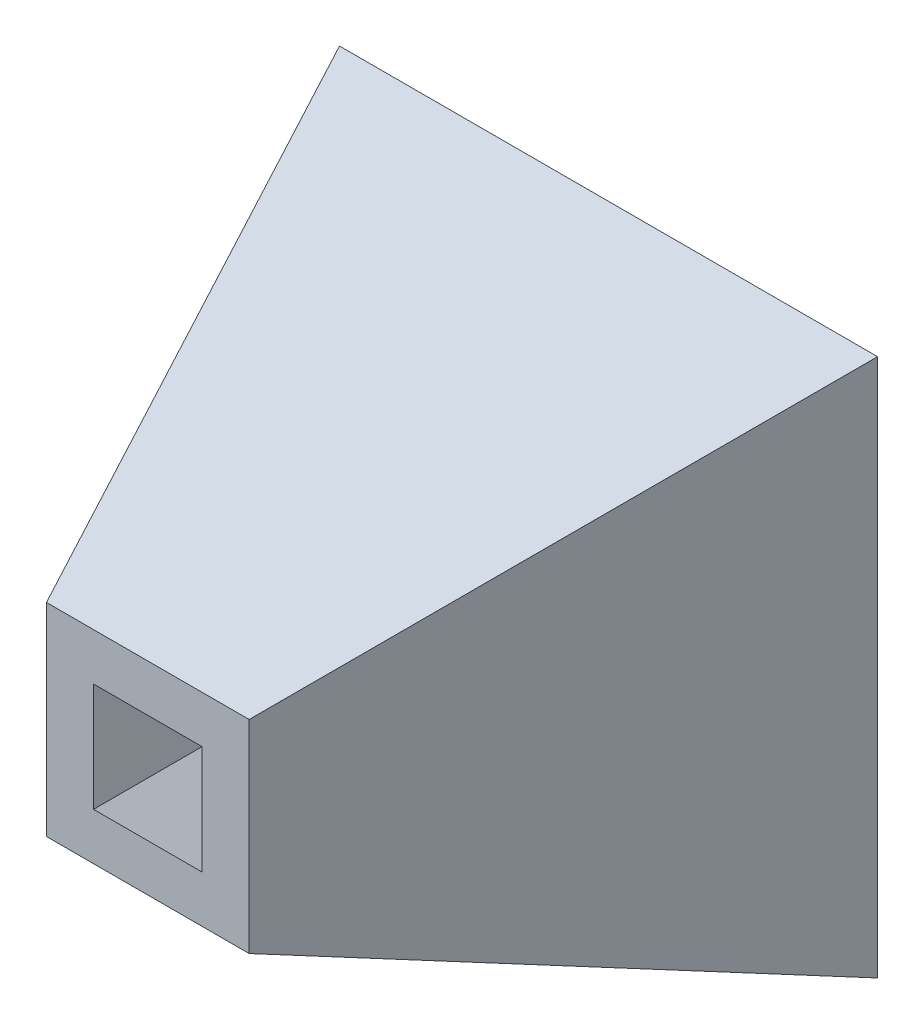
ISO-10303-21;
HEADER;
FILE_DESCRIPTION(('STEP AP214'),'2;1');
FILE_NAME('part.step','',(''),(''),'','','');
FILE_SCHEMA(('AUTOMOTIVE_DESIGN { 1 0 10303 214 1 1 1 1 }'));
ENDSEC;
DATA;
#1=APPLICATION_CONTEXT('core data for automotive mechanical design processes');
#2=APPLICATION_PROTOCOL_DEFINITION('international standard','automotive_design',2000,#1);
#3=PRODUCT_CONTEXT('',#1,'mechanical');
#4=PRODUCT('Part','Part','',(#3));
#5=PRODUCT_RELATED_PRODUCT_CATEGORY('part','',(#4));
#6=PRODUCT_DEFINITION_FORMATION('','',#4);
#7=PRODUCT_DEFINITION_CONTEXT('part definition',#1,'design');
#8=PRODUCT_DEFINITION('design','',#6,#7);
#9=PRODUCT_DEFINITION_SHAPE('','',#8);
#10=(LENGTH_UNIT() NAMED_UNIT(*) SI_UNIT(.MILLI.,.METRE.));
#11=(NAMED_UNIT(*) PLANE_ANGLE_UNIT() SI_UNIT($,.RADIAN.));
#12=(NAMED_UNIT(*) SI_UNIT($,.STERADIAN.) SOLID_ANGLE_UNIT());
#13=UNCERTAINTY_MEASURE_WITH_UNIT(LENGTH_MEASURE(1.E-05),#10,'distance_accuracy_value','');
#14=(GEOMETRIC_REPRESENTATION_CONTEXT(3) GLOBAL_UNCERTAINTY_ASSIGNED_CONTEXT((#13)) GLOBAL_UNIT_ASSIGNED_CONTEXT((#10,
#11,#12)) REPRESENTATION_CONTEXT('',''));
#15=CARTESIAN_POINT('',(0.,0.,0.));
#16=DIRECTION('',(0.,0.,1.));
#17=DIRECTION('',(1.,0.,0.));
#18=AXIS2_PLACEMENT_3D('',#15,#16,#17);
#19=CARTESIAN_POINT('',(0.,22.,50.));
#20=DIRECTION('',(-0.939692620785908,0.,0.342020143325669));
#21=DIRECTION('',(0.342020143325669,0.,0.939692620785908));
#22=AXIS2_PLACEMENT_3D('',#19,#20,#21);
#23=PLANE('',#22);
#24=DIRECTION('',(0.,1.,0.));
#25=VECTOR('',#24,1.);
#26=CARTESIAN_POINT('',(-18.1985117133102,22.,0.));
#27=LINE('',#26,#25);
#28=CARTESIAN_POINT('',(-18.1985117133102,40.1985117133102,0.));
#29=VERTEX_POINT('',#28);
#30=CARTESIAN_POINT('',(-18.1985117133102,-18.1985117133102,0.));
#31=VERTEX_POINT('',#30);
#32=EDGE_CURVE('E157',#29,#31,#27,.F.);
#33=ORIENTED_EDGE('',*,*,#32,.T.);
#34=DIRECTION('',(-0.323615577118185,-0.323615577118185,-0.889126490715988));
#35=VECTOR('',#34,1.);
#36=CARTESIAN_POINT('',(0.,0.,50.));
#37=LINE('',#36,#35);
#38=CARTESIAN_POINT('',(0.,0.,50.));
#39=VERTEX_POINT('',#38);
#40=EDGE_CURVE('E11',#39,#31,#37,.T.);
#41=ORIENTED_EDGE('',*,*,#40,.F.);
#42=DIRECTION('',(0.,-1.,0.));
#43=VECTOR('',#42,1.);
#44=CARTESIAN_POINT('',(0.,22.,50.));
#45=LINE('',#44,#43);
#46=CARTESIAN_POINT('',(0.,22.,50.));
#47=VERTEX_POINT('',#46);
#48=EDGE_CURVE('E137',#47,#39,#45,.T.);
#49=ORIENTED_EDGE('',*,*,#48,.F.);
#50=DIRECTION('',(-0.323615577118185,0.323615577118185,-0.889126490715988));
#51=VECTOR('',#50,1.);
#52=CARTESIAN_POINT('',(0.,22.,50.));
#53=LINE('',#52,#51);
#54=EDGE_CURVE('E146',#47,#29,#53,.T.);
#55=ORIENTED_EDGE('',*,*,#54,.T.);
#56=EDGE_LOOP('',(#33,#41,#49,#55));
#57=FACE_BOUND('',#56,.T.);
#58=ADVANCED_FACE('F39',(#57),#23,.T.);
#59=CARTESIAN_POINT('',(0.,0.,50.));
#60=DIRECTION('',(0.,-0.939692620785908,0.342020143325669));
#61=DIRECTION('',(0.,0.342020143325669,0.939692620785908));
#62=AXIS2_PLACEMENT_3D('',#59,#60,#61);
#63=PLANE('',#62);
#64=DIRECTION('',(-1.,0.,0.));
#65=VECTOR('',#64,1.);
#66=CARTESIAN_POINT('',(0.,-18.1985117133102,0.));
#67=LINE('',#66,#65);
#68=CARTESIAN_POINT('',(40.1985117133102,-18.1985117133102,0.));
#69=VERTEX_POINT('',#68);
#70=EDGE_CURVE('E158',#31,#69,#67,.F.);
#71=ORIENTED_EDGE('',*,*,#70,.T.);
#72=DIRECTION('',(0.323615577118185,-0.323615577118185,-0.889126490715988));
#73=VECTOR('',#72,1.);
#74=CARTESIAN_POINT('',(22.,0.,50.));
#75=LINE('',#74,#73);
#76=CARTESIAN_POINT('',(22.,0.,50.));
#77=VERTEX_POINT('',#76);
#78=EDGE_CURVE('E48',#77,#69,#75,.T.);
#79=ORIENTED_EDGE('',*,*,#78,.F.);
#80=DIRECTION('',(1.,0.,0.));
#81=VECTOR('',#80,1.);
#82=CARTESIAN_POINT('',(0.,0.,50.));
#83=LINE('',#82,#81);
#84=EDGE_CURVE('E142',#39,#77,#83,.T.);
#85=ORIENTED_EDGE('',*,*,#84,.F.);
#86=ORIENTED_EDGE('',*,*,#40,.T.);
#87=EDGE_LOOP('',(#71,#79,#85,#86));
#88=FACE_BOUND('',#87,.T.);
#89=ADVANCED_FACE('F184',(#88),#63,.T.);
#90=CARTESIAN_POINT('',(22.,0.,50.));
#91=DIRECTION('',(0.939692620785908,0.,0.342020143325669));
#92=DIRECTION('',(-0.342020143325669,0.,0.939692620785908));
#93=AXIS2_PLACEMENT_3D('',#90,#91,#92);
#94=PLANE('',#93);
#95=DIRECTION('',(0.,-1.,0.));
#96=VECTOR('',#95,1.);
#97=CARTESIAN_POINT('',(40.1985117133102,0.,0.));
#98=LINE('',#97,#96);
#99=CARTESIAN_POINT('',(40.1985117133102,40.1985117133102,0.));
#100=VERTEX_POINT('',#99);
#101=EDGE_CURVE('E156',#69,#100,#98,.F.);
#102=ORIENTED_EDGE('',*,*,#101,.T.);
#103=DIRECTION('',(0.323615577118185,0.323615577118185,-0.889126490715988));
#104=VECTOR('',#103,1.);
#105=CARTESIAN_POINT('',(22.,22.,50.));
#106=LINE('',#105,#104);
#107=CARTESIAN_POINT('',(22.,22.,50.));
#108=VERTEX_POINT('',#107);
#109=EDGE_CURVE('E149',#108,#100,#106,.T.);
#110=ORIENTED_EDGE('',*,*,#109,.F.);
#111=DIRECTION('',(0.,1.,0.));
#112=VECTOR('',#111,1.);
#113=CARTESIAN_POINT('',(22.,0.,50.));
#114=LINE('',#113,#112);
#115=EDGE_CURVE('E145',#77,#108,#114,.T.);
#116=ORIENTED_EDGE('',*,*,#115,.F.);
#117=ORIENTED_EDGE('',*,*,#78,.T.);
#118=EDGE_LOOP('',(#102,#110,#116,#117));
#119=FACE_BOUND('',#118,.T.);
#120=ADVANCED_FACE('F189',(#119),#94,.T.);
#121=CARTESIAN_POINT('',(22.,22.,50.));
#122=DIRECTION('',(0.,0.939692620785908,0.342020143325669));
#123=DIRECTION('',(0.,-0.342020143325669,0.939692620785908));
#124=AXIS2_PLACEMENT_3D('',#121,#122,#123);
#125=PLANE('',#124);
#126=DIRECTION('',(1.,0.,0.));
#127=VECTOR('',#126,1.);
#128=CARTESIAN_POINT('',(22.,40.1985117133102,0.));
#129=LINE('',#128,#127);
#130=EDGE_CURVE('E43',#100,#29,#129,.F.);
#131=ORIENTED_EDGE('',*,*,#130,.T.);
#132=ORIENTED_EDGE('',*,*,#54,.F.);
#133=DIRECTION('',(-1.,0.,0.));
#134=VECTOR('',#133,1.);
#135=CARTESIAN_POINT('',(22.,22.,50.));
#136=LINE('',#135,#134);
#137=EDGE_CURVE('E148',#108,#47,#136,.T.);
#138=ORIENTED_EDGE('',*,*,#137,.F.);
#139=ORIENTED_EDGE('',*,*,#109,.T.);
#140=EDGE_LOOP('',(#131,#132,#138,#139));
#141=FACE_BOUND('',#140,.T.);
#142=ADVANCED_FACE('F41',(#141),#125,.T.);
#143=CARTESIAN_POINT('',(0.,0.,50.));
#144=DIRECTION('',(0.,0.,1.));
#145=DIRECTION('',(1.,0.,0.));
#146=AXIS2_PLACEMENT_3D('',#143,#144,#145);
#147=PLANE('',#146);
#148=DIRECTION('',(0.,1.,0.));
#149=VECTOR('',#148,1.);
#150=CARTESIAN_POINT('',(5.10805330788438,22.,50.));
#151=LINE('',#150,#149);
#152=CARTESIAN_POINT('',(5.10805330788438,16.8919466921156,50.));
#153=VERTEX_POINT('',#152);
#154=CARTESIAN_POINT('',(5.10805330788438,5.10805330788438,50.));
#155=VERTEX_POINT('',#154);
#156=EDGE_CURVE('E130',#153,#155,#151,.F.);
#157=ORIENTED_EDGE('',*,*,#156,.F.);
#158=DIRECTION('',(1.,0.,0.));
#159=VECTOR('',#158,1.);
#160=CARTESIAN_POINT('',(22.,16.8919466921156,50.));
#161=LINE('',#160,#159);
#162=CARTESIAN_POINT('',(16.8919466921156,16.8919466921156,50.));
#163=VERTEX_POINT('',#162);
#164=EDGE_CURVE('E112',#163,#153,#161,.F.);
#165=ORIENTED_EDGE('',*,*,#164,.F.);
#166=DIRECTION('',(0.,-1.,0.));
#167=VECTOR('',#166,1.);
#168=CARTESIAN_POINT('',(16.8919466921156,0.,50.));
#169=LINE('',#168,#167);
#170=CARTESIAN_POINT('',(16.8919466921156,5.10805330788438,50.));
#171=VERTEX_POINT('',#170);
#172=EDGE_CURVE('E136',#171,#163,#169,.F.);
#173=ORIENTED_EDGE('',*,*,#172,.F.);
#174=DIRECTION('',(-1.,0.,0.));
#175=VECTOR('',#174,1.);
#176=CARTESIAN_POINT('',(0.,5.10805330788438,50.));
#177=LINE('',#176,#175);
#178=EDGE_CURVE('E129',#155,#171,#177,.F.);
#179=ORIENTED_EDGE('',*,*,#178,.F.);
#180=EDGE_LOOP('',(#157,#165,#173,#179));
#181=FACE_BOUND('',#180,.T.);
#182=ORIENTED_EDGE('',*,*,#48,.T.);
#183=ORIENTED_EDGE('',*,*,#84,.T.);
#184=ORIENTED_EDGE('',*,*,#115,.T.);
#185=ORIENTED_EDGE('',*,*,#137,.T.);
#186=EDGE_LOOP('',(#182,#183,#184,#185));
#187=FACE_BOUND('',#186,.T.);
#188=ADVANCED_FACE('F171',(#181,#187),#147,.T.);
#189=CARTESIAN_POINT('',(0.,0.,0.));
#190=DIRECTION('',(0.,0.,1.));
#191=DIRECTION('',(1.,0.,0.));
#192=AXIS2_PLACEMENT_3D('',#189,#190,#191);
#193=PLANE('',#192);
#194=DIRECTION('',(1.,0.,0.));
#195=VECTOR('',#194,1.);
#196=CARTESIAN_POINT('',(22.,35.0904584054258,0.));
#197=LINE('',#196,#195);
#198=CARTESIAN_POINT('',(35.0904584054258,35.0904584054258,0.));
#199=VERTEX_POINT('',#198);
#200=CARTESIAN_POINT('',(-13.0904584054258,35.0904584054258,0.));
#201=VERTEX_POINT('',#200);
#202=EDGE_CURVE('E108',#199,#201,#197,.F.);
#203=ORIENTED_EDGE('',*,*,#202,.T.);
#204=DIRECTION('',(0.,1.,0.));
#205=VECTOR('',#204,1.);
#206=CARTESIAN_POINT('',(-13.0904584054258,22.,0.));
#207=LINE('',#206,#205);
#208=CARTESIAN_POINT('',(-13.0904584054258,-13.0904584054258,0.));
#209=VERTEX_POINT('',#208);
#210=EDGE_CURVE('E117',#201,#209,#207,.F.);
#211=ORIENTED_EDGE('',*,*,#210,.T.);
#212=DIRECTION('',(-1.,0.,0.));
#213=VECTOR('',#212,1.);
#214=CARTESIAN_POINT('',(0.,-13.0904584054258,0.));
#215=LINE('',#214,#213);
#216=CARTESIAN_POINT('',(35.0904584054258,-13.0904584054258,0.));
#217=VERTEX_POINT('',#216);
#218=EDGE_CURVE('E123',#209,#217,#215,.F.);
#219=ORIENTED_EDGE('',*,*,#218,.T.);
#220=DIRECTION('',(0.,-1.,0.));
#221=VECTOR('',#220,1.);
#222=CARTESIAN_POINT('',(35.0904584054258,0.,0.));
#223=LINE('',#222,#221);
#224=EDGE_CURVE('E64',#217,#199,#223,.F.);
#225=ORIENTED_EDGE('',*,*,#224,.T.);
#226=EDGE_LOOP('',(#203,#211,#219,#225));
#227=FACE_BOUND('',#226,.T.);
#228=ORIENTED_EDGE('',*,*,#32,.F.);
#229=ORIENTED_EDGE('',*,*,#130,.F.);
#230=ORIENTED_EDGE('',*,*,#101,.F.);
#231=ORIENTED_EDGE('',*,*,#70,.F.);
#232=EDGE_LOOP('',(#228,#229,#230,#231));
#233=FACE_BOUND('',#232,.T.);
#234=ADVANCED_FACE('F124',(#227,#233),#193,.F.);
#235=CARTESIAN_POINT('',(4.51052457977236,22.,48.3583033120368));
#236=DIRECTION('',(-0.939692620785908,0.,0.342020143325669));
#237=DIRECTION('',(0.342020143325669,0.,0.939692620785908));
#238=AXIS2_PLACEMENT_3D('',#235,#236,#237);
#239=PLANE('',#238);
#240=ORIENTED_EDGE('',*,*,#210,.F.);
#241=DIRECTION('',(-0.323615577118185,0.323615577118185,-0.889126490715988));
#242=VECTOR('',#241,1.);
#243=CARTESIAN_POINT('',(4.03815068377619,17.9618493162238,47.0604666992475));
#244=LINE('',#243,#242);
#245=EDGE_CURVE('E104',#153,#201,#244,.T.);
#246=ORIENTED_EDGE('',*,*,#245,.F.);
#247=ORIENTED_EDGE('',*,*,#156,.T.);
#248=DIRECTION('',(-0.323615577118185,-0.323615577118185,-0.889126490715988));
#249=VECTOR('',#248,1.);
#250=CARTESIAN_POINT('',(4.03815068377619,4.03815068377619,47.0604666992475));
#251=LINE('',#250,#249);
#252=EDGE_CURVE('E120',#155,#209,#251,.T.);
#253=ORIENTED_EDGE('',*,*,#252,.T.);
#254=EDGE_LOOP('',(#240,#246,#247,#253));
#255=FACE_BOUND('',#254,.T.);
#256=ADVANCED_FACE('F119',(#255),#239,.F.);
#257=CARTESIAN_POINT('',(0.,4.51052457977236,48.3583033120368));
#258=DIRECTION('',(0.,-0.939692620785908,0.342020143325669));
#259=DIRECTION('',(0.,0.342020143325669,0.939692620785908));
#260=AXIS2_PLACEMENT_3D('',#257,#258,#259);
#261=PLANE('',#260);
#262=ORIENTED_EDGE('',*,*,#218,.F.);
#263=ORIENTED_EDGE('',*,*,#252,.F.);
#264=ORIENTED_EDGE('',*,*,#178,.T.);
#265=DIRECTION('',(0.323615577118185,-0.323615577118185,-0.889126490715988));
#266=VECTOR('',#265,1.);
#267=CARTESIAN_POINT('',(17.9618493162238,4.03815068377619,47.0604666992475));
#268=LINE('',#267,#266);
#269=EDGE_CURVE('E163',#171,#217,#268,.T.);
#270=ORIENTED_EDGE('',*,*,#269,.T.);
#271=EDGE_LOOP('',(#262,#263,#264,#270));
#272=FACE_BOUND('',#271,.T.);
#273=ADVANCED_FACE('F173',(#272),#261,.F.);
#274=CARTESIAN_POINT('',(17.4894754202276,0.,48.3583033120368));
#275=DIRECTION('',(0.939692620785908,0.,0.342020143325669));
#276=DIRECTION('',(-0.342020143325669,0.,0.939692620785908));
#277=AXIS2_PLACEMENT_3D('',#274,#275,#276);
#278=PLANE('',#277);
#279=ORIENTED_EDGE('',*,*,#224,.F.);
#280=ORIENTED_EDGE('',*,*,#269,.F.);
#281=ORIENTED_EDGE('',*,*,#172,.T.);
#282=DIRECTION('',(0.323615577118185,0.323615577118185,-0.889126490715988));
#283=VECTOR('',#282,1.);
#284=CARTESIAN_POINT('',(17.9618493162238,17.9618493162238,47.0604666992475));
#285=LINE('',#284,#283);
#286=EDGE_CURVE('E57',#163,#199,#285,.T.);
#287=ORIENTED_EDGE('',*,*,#286,.T.);
#288=EDGE_LOOP('',(#279,#280,#281,#287));
#289=FACE_BOUND('',#288,.T.);
#290=ADVANCED_FACE('F170',(#289),#278,.F.);
#291=CARTESIAN_POINT('',(22.,17.4894754202276,48.3583033120368));
#292=DIRECTION('',(0.,0.939692620785908,0.342020143325669));
#293=DIRECTION('',(0.,-0.342020143325669,0.939692620785908));
#294=AXIS2_PLACEMENT_3D('',#291,#292,#293);
#295=PLANE('',#294);
#296=ORIENTED_EDGE('',*,*,#202,.F.);
#297=ORIENTED_EDGE('',*,*,#286,.F.);
#298=ORIENTED_EDGE('',*,*,#164,.T.);
#299=ORIENTED_EDGE('',*,*,#245,.T.);
#300=EDGE_LOOP('',(#296,#297,#298,#299));
#301=FACE_BOUND('',#300,.T.);
#302=ADVANCED_FACE('F110',(#301),#295,.F.);
#303=CLOSED_SHELL('',(#58,#89,#120,#142,#188,#234,#256,#273,#290,#302));
#304=MANIFOLD_SOLID_BREP('B2',#303);
#305=ADVANCED_BREP_SHAPE_REPRESENTATION('',(#18,#304),#14);
#306=SHAPE_DEFINITION_REPRESENTATION(#9,#305);
ENDSEC;
END-ISO-10303-21;
